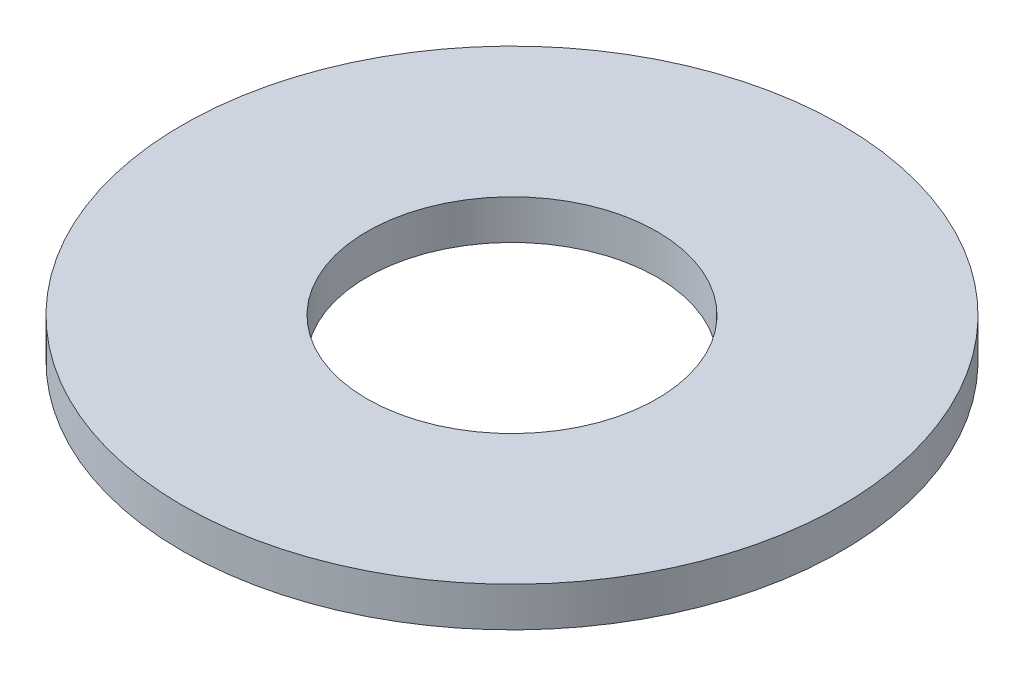
ISO-10303-21;
HEADER;
FILE_DESCRIPTION(('STEP AP214'),'2;1');
FILE_NAME('part.step','',(''),(''),'','','');
FILE_SCHEMA(('AUTOMOTIVE_DESIGN { 1 0 10303 214 1 1 1 1 }'));
ENDSEC;
DATA;
#1=APPLICATION_CONTEXT('core data for automotive mechanical design processes');
#2=APPLICATION_PROTOCOL_DEFINITION('international standard','automotive_design',2000,#1);
#3=PRODUCT_CONTEXT('',#1,'mechanical');
#4=PRODUCT('Part','Part','',(#3));
#5=PRODUCT_RELATED_PRODUCT_CATEGORY('part','',(#4));
#6=PRODUCT_DEFINITION_FORMATION('','',#4);
#7=PRODUCT_DEFINITION_CONTEXT('part definition',#1,'design');
#8=PRODUCT_DEFINITION('design','',#6,#7);
#9=PRODUCT_DEFINITION_SHAPE('','',#8);
#10=(LENGTH_UNIT() NAMED_UNIT(*) SI_UNIT(.MILLI.,.METRE.));
#11=(NAMED_UNIT(*) PLANE_ANGLE_UNIT() SI_UNIT($,.RADIAN.));
#12=(NAMED_UNIT(*) SI_UNIT($,.STERADIAN.) SOLID_ANGLE_UNIT());
#13=UNCERTAINTY_MEASURE_WITH_UNIT(LENGTH_MEASURE(1.E-05),#10,'distance_accuracy_value','');
#14=(GEOMETRIC_REPRESENTATION_CONTEXT(3) GLOBAL_UNCERTAINTY_ASSIGNED_CONTEXT((#13)) GLOBAL_UNIT_ASSIGNED_CONTEXT((#10,
#11,#12)) REPRESENTATION_CONTEXT('',''));
#15=CARTESIAN_POINT('',(0.,0.,0.));
#16=DIRECTION('',(0.,0.,1.));
#17=DIRECTION('',(1.,0.,0.));
#18=AXIS2_PLACEMENT_3D('',#15,#16,#17);
#19=CARTESIAN_POINT('',(0.,0.3,0.));
#20=DIRECTION('',(0.,-1.,0.));
#21=DIRECTION('',(0.,0.,-1.));
#22=AXIS2_PLACEMENT_3D('',#19,#20,#21);
#23=CYLINDRICAL_SURFACE('',#22,2.5);
#24=CARTESIAN_POINT('',(0.,0.3,0.));
#25=DIRECTION('',(0.,1.,0.));
#26=DIRECTION('',(0.,0.,1.));
#27=AXIS2_PLACEMENT_3D('',#24,#25,#26);
#28=CIRCLE('',#27,2.5);
#29=CARTESIAN_POINT('',(0.,0.3,2.5));
#30=VERTEX_POINT('',#29);
#31=EDGE_CURVE('E10',#30,#30,#28,.T.);
#32=ORIENTED_EDGE('',*,*,#31,.F.);
#33=EDGE_LOOP('',(#32));
#34=FACE_BOUND('',#33,.T.);
#35=CARTESIAN_POINT('',(0.,0.,0.));
#36=DIRECTION('',(0.,1.,0.));
#37=DIRECTION('',(0.,0.,1.));
#38=AXIS2_PLACEMENT_3D('',#35,#36,#37);
#39=CIRCLE('',#38,2.5);
#40=CARTESIAN_POINT('',(0.,0.,2.5));
#41=VERTEX_POINT('',#40);
#42=EDGE_CURVE('E33',#41,#41,#39,.T.);
#43=ORIENTED_EDGE('',*,*,#42,.T.);
#44=EDGE_LOOP('',(#43));
#45=FACE_BOUND('',#44,.T.);
#46=ADVANCED_FACE('F26',(#34,#45),#23,.T.);
#47=CARTESIAN_POINT('',(0.,0.3,0.));
#48=DIRECTION('',(0.,1.,0.));
#49=DIRECTION('',(0.,0.,1.));
#50=AXIS2_PLACEMENT_3D('',#47,#48,#49);
#51=PLANE('',#50);
#52=CARTESIAN_POINT('',(0.,0.3,0.));
#53=DIRECTION('',(0.,1.,0.));
#54=DIRECTION('',(0.,0.,1.));
#55=AXIS2_PLACEMENT_3D('',#52,#53,#54);
#56=CIRCLE('',#55,1.1);
#57=CARTESIAN_POINT('',(0.,0.3,1.1));
#58=VERTEX_POINT('',#57);
#59=EDGE_CURVE('E39',#58,#58,#56,.T.);
#60=ORIENTED_EDGE('',*,*,#59,.F.);
#61=EDGE_LOOP('',(#60));
#62=FACE_BOUND('',#61,.T.);
#63=ORIENTED_EDGE('',*,*,#31,.T.);
#64=EDGE_LOOP('',(#63));
#65=FACE_BOUND('',#64,.T.);
#66=ADVANCED_FACE('F55',(#62,#65),#51,.T.);
#67=CARTESIAN_POINT('',(0.,0.,0.));
#68=DIRECTION('',(0.,1.,0.));
#69=DIRECTION('',(0.,0.,1.));
#70=AXIS2_PLACEMENT_3D('',#67,#68,#69);
#71=PLANE('',#70);
#72=CARTESIAN_POINT('',(0.,0.,0.));
#73=DIRECTION('',(0.,1.,0.));
#74=DIRECTION('',(0.,0.,1.));
#75=AXIS2_PLACEMENT_3D('',#72,#73,#74);
#76=CIRCLE('',#75,1.1);
#77=CARTESIAN_POINT('',(0.,0.,1.1));
#78=VERTEX_POINT('',#77);
#79=EDGE_CURVE('E29',#78,#78,#76,.T.);
#80=ORIENTED_EDGE('',*,*,#79,.T.);
#81=EDGE_LOOP('',(#80));
#82=FACE_BOUND('',#81,.T.);
#83=ORIENTED_EDGE('',*,*,#42,.F.);
#84=EDGE_LOOP('',(#83));
#85=FACE_BOUND('',#84,.T.);
#86=ADVANCED_FACE('F46',(#82,#85),#71,.F.);
#87=CARTESIAN_POINT('',(0.,-0.5,0.));
#88=DIRECTION('',(0.,1.,0.));
#89=DIRECTION('',(0.,0.,1.));
#90=AXIS2_PLACEMENT_3D('',#87,#88,#89);
#91=CYLINDRICAL_SURFACE('',#90,1.1);
#92=ORIENTED_EDGE('',*,*,#59,.T.);
#93=EDGE_LOOP('',(#92));
#94=FACE_BOUND('',#93,.T.);
#95=ORIENTED_EDGE('',*,*,#79,.F.);
#96=EDGE_LOOP('',(#95));
#97=FACE_BOUND('',#96,.T.);
#98=ADVANCED_FACE('F49',(#94,#97),#91,.F.);
#99=CLOSED_SHELL('',(#46,#66,#86,#98));
#100=MANIFOLD_SOLID_BREP('B2',#99);
#101=ADVANCED_BREP_SHAPE_REPRESENTATION('',(#18,#100),#14);
#102=SHAPE_DEFINITION_REPRESENTATION(#9,#101);
ENDSEC;
END-ISO-10303-21;
